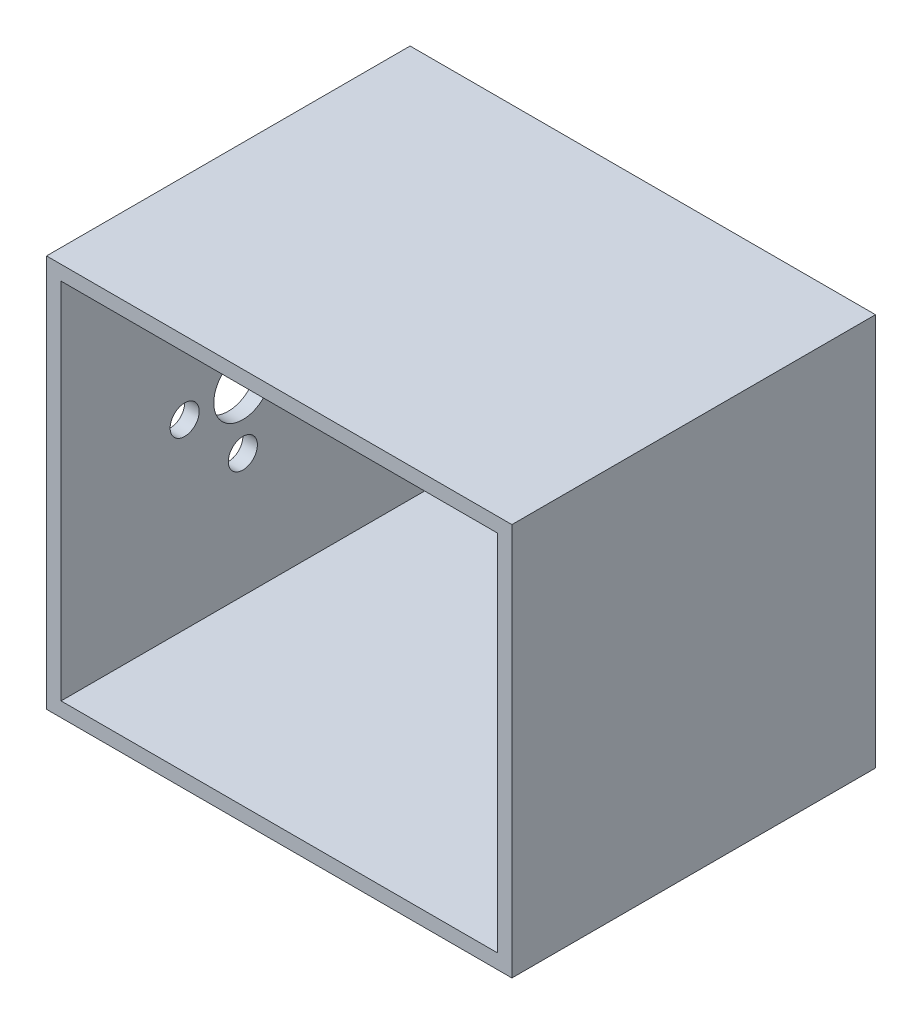
ISO-10303-21;
HEADER;
FILE_DESCRIPTION(('STEP AP214'),'2;1');
FILE_NAME('part.step','',(''),(''),'','','');
FILE_SCHEMA(('AUTOMOTIVE_DESIGN { 1 0 10303 214 1 1 1 1 }'));
ENDSEC;
DATA;
#1=APPLICATION_CONTEXT('core data for automotive mechanical design processes');
#2=APPLICATION_PROTOCOL_DEFINITION('international standard','automotive_design',2000,#1);
#3=PRODUCT_CONTEXT('',#1,'mechanical');
#4=PRODUCT('Part','Part','',(#3));
#5=PRODUCT_RELATED_PRODUCT_CATEGORY('part','',(#4));
#6=PRODUCT_DEFINITION_FORMATION('','',#4);
#7=PRODUCT_DEFINITION_CONTEXT('part definition',#1,'design');
#8=PRODUCT_DEFINITION('design','',#6,#7);
#9=PRODUCT_DEFINITION_SHAPE('','',#8);
#10=(LENGTH_UNIT() NAMED_UNIT(*) SI_UNIT(.MILLI.,.METRE.));
#11=(NAMED_UNIT(*) PLANE_ANGLE_UNIT() SI_UNIT($,.RADIAN.));
#12=(NAMED_UNIT(*) SI_UNIT($,.STERADIAN.) SOLID_ANGLE_UNIT());
#13=UNCERTAINTY_MEASURE_WITH_UNIT(LENGTH_MEASURE(1.E-05),#10,'distance_accuracy_value','');
#14=(GEOMETRIC_REPRESENTATION_CONTEXT(3) GLOBAL_UNCERTAINTY_ASSIGNED_CONTEXT((#13)) GLOBAL_UNIT_ASSIGNED_CONTEXT((#10,
#11,#12)) REPRESENTATION_CONTEXT('',''));
#15=CARTESIAN_POINT('',(0.,0.,0.));
#16=DIRECTION('',(0.,0.,1.));
#17=DIRECTION('',(1.,0.,0.));
#18=AXIS2_PLACEMENT_3D('',#15,#16,#17);
#19=CARTESIAN_POINT('',(0.,0.,50.));
#20=DIRECTION('',(0.,0.,1.));
#21=DIRECTION('',(1.,0.,0.));
#22=AXIS2_PLACEMENT_3D('',#19,#20,#21);
#23=PLANE('',#22);
#24=DIRECTION('',(0.,-1.,0.));
#25=VECTOR('',#24,1.);
#26=CARTESIAN_POINT('',(-2.,0.,50.));
#27=LINE('',#26,#25);
#28=CARTESIAN_POINT('',(-2.,52.,50.));
#29=VERTEX_POINT('',#28);
#30=CARTESIAN_POINT('',(-2.,-2.,50.));
#31=VERTEX_POINT('',#30);
#32=EDGE_CURVE('E162',#29,#31,#27,.T.);
#33=ORIENTED_EDGE('',*,*,#32,.T.);
#34=DIRECTION('',(1.,0.,0.));
#35=VECTOR('',#34,1.);
#36=CARTESIAN_POINT('',(0.,-2.,50.));
#37=LINE('',#36,#35);
#38=CARTESIAN_POINT('',(62.,-2.,50.));
#39=VERTEX_POINT('',#38);
#40=EDGE_CURVE('E165',#31,#39,#37,.T.);
#41=ORIENTED_EDGE('',*,*,#40,.T.);
#42=DIRECTION('',(0.,1.,0.));
#43=VECTOR('',#42,1.);
#44=CARTESIAN_POINT('',(62.,0.,50.));
#45=LINE('',#44,#43);
#46=CARTESIAN_POINT('',(62.,52.,50.));
#47=VERTEX_POINT('',#46);
#48=EDGE_CURVE('E168',#39,#47,#45,.T.);
#49=ORIENTED_EDGE('',*,*,#48,.T.);
#50=DIRECTION('',(-1.,0.,0.));
#51=VECTOR('',#50,1.);
#52=CARTESIAN_POINT('',(0.,52.,50.));
#53=LINE('',#52,#51);
#54=EDGE_CURVE('E170',#47,#29,#53,.T.);
#55=ORIENTED_EDGE('',*,*,#54,.T.);
#56=EDGE_LOOP('',(#33,#41,#49,#55));
#57=FACE_BOUND('',#56,.T.);
#58=DIRECTION('',(1.,0.,0.));
#59=VECTOR('',#58,1.);
#60=CARTESIAN_POINT('',(0.,0.,50.));
#61=LINE('',#60,#59);
#62=CARTESIAN_POINT('',(0.,0.,50.));
#63=VERTEX_POINT('',#62);
#64=CARTESIAN_POINT('',(60.,0.,50.));
#65=VERTEX_POINT('',#64);
#66=EDGE_CURVE('E132',#63,#65,#61,.T.);
#67=ORIENTED_EDGE('',*,*,#66,.F.);
#68=DIRECTION('',(0.,-1.,0.));
#69=VECTOR('',#68,1.);
#70=CARTESIAN_POINT('',(0.,0.,50.));
#71=LINE('',#70,#69);
#72=CARTESIAN_POINT('',(0.,50.,50.));
#73=VERTEX_POINT('',#72);
#74=EDGE_CURVE('E124',#73,#63,#71,.T.);
#75=ORIENTED_EDGE('',*,*,#74,.F.);
#76=DIRECTION('',(-1.,0.,0.));
#77=VECTOR('',#76,1.);
#78=CARTESIAN_POINT('',(0.,50.,50.));
#79=LINE('',#78,#77);
#80=CARTESIAN_POINT('',(60.,50.,50.));
#81=VERTEX_POINT('',#80);
#82=EDGE_CURVE('E146',#81,#73,#79,.T.);
#83=ORIENTED_EDGE('',*,*,#82,.F.);
#84=DIRECTION('',(0.,1.,0.));
#85=VECTOR('',#84,1.);
#86=CARTESIAN_POINT('',(60.,0.,50.));
#87=LINE('',#86,#85);
#88=EDGE_CURVE('E144',#65,#81,#87,.T.);
#89=ORIENTED_EDGE('',*,*,#88,.F.);
#90=EDGE_LOOP('',(#67,#75,#83,#89));
#91=FACE_BOUND('',#90,.T.);
#92=ADVANCED_FACE('F59',(#57,#91),#23,.T.);
#93=CARTESIAN_POINT('',(0.,0.,0.));
#94=DIRECTION('',(0.,0.,1.));
#95=DIRECTION('',(1.,0.,0.));
#96=AXIS2_PLACEMENT_3D('',#93,#94,#95);
#97=PLANE('',#96);
#98=DIRECTION('',(0.,-1.,0.));
#99=VECTOR('',#98,1.);
#100=CARTESIAN_POINT('',(-2.,0.,0.));
#101=LINE('',#100,#99);
#102=CARTESIAN_POINT('',(-2.,52.,0.));
#103=VERTEX_POINT('',#102);
#104=CARTESIAN_POINT('',(-2.,-2.,0.));
#105=VERTEX_POINT('',#104);
#106=EDGE_CURVE('E140',#103,#105,#101,.T.);
#107=ORIENTED_EDGE('',*,*,#106,.F.);
#108=DIRECTION('',(-1.,0.,0.));
#109=VECTOR('',#108,1.);
#110=CARTESIAN_POINT('',(0.,52.,0.));
#111=LINE('',#110,#109);
#112=CARTESIAN_POINT('',(62.,52.,0.));
#113=VERTEX_POINT('',#112);
#114=EDGE_CURVE('E166',#113,#103,#111,.T.);
#115=ORIENTED_EDGE('',*,*,#114,.F.);
#116=DIRECTION('',(0.,1.,0.));
#117=VECTOR('',#116,1.);
#118=CARTESIAN_POINT('',(62.,0.,0.));
#119=LINE('',#118,#117);
#120=CARTESIAN_POINT('',(62.,-2.,0.));
#121=VERTEX_POINT('',#120);
#122=EDGE_CURVE('E177',#121,#113,#119,.T.);
#123=ORIENTED_EDGE('',*,*,#122,.F.);
#124=DIRECTION('',(1.,0.,0.));
#125=VECTOR('',#124,1.);
#126=CARTESIAN_POINT('',(0.,-2.,0.));
#127=LINE('',#126,#125);
#128=EDGE_CURVE('E175',#105,#121,#127,.T.);
#129=ORIENTED_EDGE('',*,*,#128,.F.);
#130=EDGE_LOOP('',(#107,#115,#123,#129));
#131=FACE_BOUND('',#130,.T.);
#132=DIRECTION('',(0.,-1.,0.));
#133=VECTOR('',#132,1.);
#134=CARTESIAN_POINT('',(0.,0.,0.));
#135=LINE('',#134,#133);
#136=CARTESIAN_POINT('',(0.,50.,0.));
#137=VERTEX_POINT('',#136);
#138=CARTESIAN_POINT('',(0.,0.,0.));
#139=VERTEX_POINT('',#138);
#140=EDGE_CURVE('E82',#137,#139,#135,.T.);
#141=ORIENTED_EDGE('',*,*,#140,.T.);
#142=DIRECTION('',(1.,0.,0.));
#143=VECTOR('',#142,1.);
#144=CARTESIAN_POINT('',(0.,0.,0.));
#145=LINE('',#144,#143);
#146=CARTESIAN_POINT('',(60.,0.,0.));
#147=VERTEX_POINT('',#146);
#148=EDGE_CURVE('E139',#139,#147,#145,.T.);
#149=ORIENTED_EDGE('',*,*,#148,.T.);
#150=DIRECTION('',(0.,1.,0.));
#151=VECTOR('',#150,1.);
#152=CARTESIAN_POINT('',(60.,0.,0.));
#153=LINE('',#152,#151);
#154=CARTESIAN_POINT('',(60.,50.,0.));
#155=VERTEX_POINT('',#154);
#156=EDGE_CURVE('E154',#147,#155,#153,.T.);
#157=ORIENTED_EDGE('',*,*,#156,.T.);
#158=DIRECTION('',(-1.,0.,0.));
#159=VECTOR('',#158,1.);
#160=CARTESIAN_POINT('',(0.,50.,0.));
#161=LINE('',#160,#159);
#162=EDGE_CURVE('E133',#155,#137,#161,.T.);
#163=ORIENTED_EDGE('',*,*,#162,.T.);
#164=EDGE_LOOP('',(#141,#149,#157,#163));
#165=FACE_BOUND('',#164,.T.);
#166=ADVANCED_FACE('F195',(#131,#165),#97,.F.);
#167=CARTESIAN_POINT('',(-2.,0.,50.));
#168=DIRECTION('',(1.,0.,0.));
#169=DIRECTION('',(0.,0.,-1.));
#170=AXIS2_PLACEMENT_3D('',#167,#168,#169);
#171=PLANE('',#170);
#172=CARTESIAN_POINT('',(-2.,17.,25.));
#173=DIRECTION('',(-1.,0.,0.));
#174=DIRECTION('',(0.,0.,-1.));
#175=AXIS2_PLACEMENT_3D('',#172,#173,#174);
#176=CIRCLE('',#175,2.);
#177=CARTESIAN_POINT('',(-2.,17.,23.));
#178=VERTEX_POINT('',#177);
#179=EDGE_CURVE('E263',#178,#178,#176,.T.);
#180=ORIENTED_EDGE('',*,*,#179,.F.);
#181=EDGE_LOOP('',(#180));
#182=FACE_BOUND('',#181,.T.);
#183=CARTESIAN_POINT('',(-2.,33.,25.));
#184=DIRECTION('',(-1.,0.,0.));
#185=DIRECTION('',(0.,0.,1.));
#186=AXIS2_PLACEMENT_3D('',#183,#184,#185);
#187=CIRCLE('',#186,2.);
#188=CARTESIAN_POINT('',(-2.,33.,27.));
#189=VERTEX_POINT('',#188);
#190=EDGE_CURVE('E260',#189,#189,#187,.T.);
#191=ORIENTED_EDGE('',*,*,#190,.F.);
#192=EDGE_LOOP('',(#191));
#193=FACE_BOUND('',#192,.T.);
#194=CARTESIAN_POINT('',(-2.,25.,17.));
#195=DIRECTION('',(-1.,0.,0.));
#196=DIRECTION('',(0.,0.,-1.));
#197=AXIS2_PLACEMENT_3D('',#194,#195,#196);
#198=CIRCLE('',#197,2.);
#199=CARTESIAN_POINT('',(-2.,25.,15.));
#200=VERTEX_POINT('',#199);
#201=EDGE_CURVE('E257',#200,#200,#198,.T.);
#202=ORIENTED_EDGE('',*,*,#201,.F.);
#203=EDGE_LOOP('',(#202));
#204=FACE_BOUND('',#203,.T.);
#205=CARTESIAN_POINT('',(-2.,25.,33.));
#206=DIRECTION('',(-1.,0.,0.));
#207=DIRECTION('',(0.,0.,1.));
#208=AXIS2_PLACEMENT_3D('',#205,#206,#207);
#209=CIRCLE('',#208,2.);
#210=CARTESIAN_POINT('',(-2.,25.,35.));
#211=VERTEX_POINT('',#210);
#212=EDGE_CURVE('E251',#211,#211,#209,.T.);
#213=ORIENTED_EDGE('',*,*,#212,.F.);
#214=EDGE_LOOP('',(#213));
#215=FACE_BOUND('',#214,.T.);
#216=CARTESIAN_POINT('',(-2.,25.,25.));
#217=DIRECTION('',(-1.,0.,0.));
#218=DIRECTION('',(0.,0.,1.));
#219=AXIS2_PLACEMENT_3D('',#216,#217,#218);
#220=CIRCLE('',#219,4.);
#221=CARTESIAN_POINT('',(-2.,25.,29.));
#222=VERTEX_POINT('',#221);
#223=EDGE_CURVE('E152',#222,#222,#220,.T.);
#224=ORIENTED_EDGE('',*,*,#223,.F.);
#225=EDGE_LOOP('',(#224));
#226=FACE_BOUND('',#225,.T.);
#227=ORIENTED_EDGE('',*,*,#106,.T.);
#228=DIRECTION('',(0.,0.,-1.));
#229=VECTOR('',#228,1.);
#230=CARTESIAN_POINT('',(-2.,-2.,50.));
#231=LINE('',#230,#229);
#232=EDGE_CURVE('E12',#31,#105,#231,.T.);
#233=ORIENTED_EDGE('',*,*,#232,.F.);
#234=ORIENTED_EDGE('',*,*,#32,.F.);
#235=DIRECTION('',(0.,0.,-1.));
#236=VECTOR('',#235,1.);
#237=CARTESIAN_POINT('',(-2.,52.,50.));
#238=LINE('',#237,#236);
#239=EDGE_CURVE('E172',#29,#103,#238,.T.);
#240=ORIENTED_EDGE('',*,*,#239,.T.);
#241=EDGE_LOOP('',(#227,#233,#234,#240));
#242=FACE_BOUND('',#241,.T.);
#243=ADVANCED_FACE('F61',(#182,#193,#204,#215,#226,#242),#171,.F.);
#244=CARTESIAN_POINT('',(0.,-2.,50.));
#245=DIRECTION('',(0.,1.,0.));
#246=DIRECTION('',(0.,0.,1.));
#247=AXIS2_PLACEMENT_3D('',#244,#245,#246);
#248=PLANE('',#247);
#249=ORIENTED_EDGE('',*,*,#128,.T.);
#250=DIRECTION('',(0.,0.,-1.));
#251=VECTOR('',#250,1.);
#252=CARTESIAN_POINT('',(62.,-2.,50.));
#253=LINE('',#252,#251);
#254=EDGE_CURVE('E67',#39,#121,#253,.T.);
#255=ORIENTED_EDGE('',*,*,#254,.F.);
#256=ORIENTED_EDGE('',*,*,#40,.F.);
#257=ORIENTED_EDGE('',*,*,#232,.T.);
#258=EDGE_LOOP('',(#249,#255,#256,#257));
#259=FACE_BOUND('',#258,.T.);
#260=ADVANCED_FACE('F205',(#259),#248,.F.);
#261=CARTESIAN_POINT('',(62.,0.,50.));
#262=DIRECTION('',(-1.,0.,0.));
#263=DIRECTION('',(0.,0.,1.));
#264=AXIS2_PLACEMENT_3D('',#261,#262,#263);
#265=PLANE('',#264);
#266=ORIENTED_EDGE('',*,*,#122,.T.);
#267=DIRECTION('',(0.,0.,-1.));
#268=VECTOR('',#267,1.);
#269=CARTESIAN_POINT('',(62.,52.,50.));
#270=LINE('',#269,#268);
#271=EDGE_CURVE('E182',#47,#113,#270,.T.);
#272=ORIENTED_EDGE('',*,*,#271,.F.);
#273=ORIENTED_EDGE('',*,*,#48,.F.);
#274=ORIENTED_EDGE('',*,*,#254,.T.);
#275=EDGE_LOOP('',(#266,#272,#273,#274));
#276=FACE_BOUND('',#275,.T.);
#277=ADVANCED_FACE('F189',(#276),#265,.F.);
#278=CARTESIAN_POINT('',(0.,52.,50.));
#279=DIRECTION('',(0.,-1.,0.));
#280=DIRECTION('',(0.,0.,-1.));
#281=AXIS2_PLACEMENT_3D('',#278,#279,#280);
#282=PLANE('',#281);
#283=ORIENTED_EDGE('',*,*,#114,.T.);
#284=ORIENTED_EDGE('',*,*,#239,.F.);
#285=ORIENTED_EDGE('',*,*,#54,.F.);
#286=ORIENTED_EDGE('',*,*,#271,.T.);
#287=EDGE_LOOP('',(#283,#284,#285,#286));
#288=FACE_BOUND('',#287,.T.);
#289=ADVANCED_FACE('F199',(#288),#282,.F.);
#290=CARTESIAN_POINT('',(0.,0.,50.));
#291=DIRECTION('',(1.,0.,0.));
#292=DIRECTION('',(0.,0.,-1.));
#293=AXIS2_PLACEMENT_3D('',#290,#291,#292);
#294=PLANE('',#293);
#295=CARTESIAN_POINT('',(0.,17.,25.));
#296=DIRECTION('',(1.,0.,0.));
#297=DIRECTION('',(0.,0.,-1.));
#298=AXIS2_PLACEMENT_3D('',#295,#296,#297);
#299=CIRCLE('',#298,2.);
#300=CARTESIAN_POINT('',(0.,17.,23.));
#301=VERTEX_POINT('',#300);
#302=EDGE_CURVE('E234',#301,#301,#299,.F.);
#303=ORIENTED_EDGE('',*,*,#302,.T.);
#304=EDGE_LOOP('',(#303));
#305=FACE_BOUND('',#304,.T.);
#306=CARTESIAN_POINT('',(0.,33.,25.));
#307=DIRECTION('',(1.,0.,0.));
#308=DIRECTION('',(0.,0.,-1.));
#309=AXIS2_PLACEMENT_3D('',#306,#307,#308);
#310=CIRCLE('',#309,2.);
#311=CARTESIAN_POINT('',(0.,33.,23.));
#312=VERTEX_POINT('',#311);
#313=EDGE_CURVE('E238',#312,#312,#310,.F.);
#314=ORIENTED_EDGE('',*,*,#313,.T.);
#315=EDGE_LOOP('',(#314));
#316=FACE_BOUND('',#315,.T.);
#317=CARTESIAN_POINT('',(0.,25.,17.));
#318=DIRECTION('',(1.,0.,0.));
#319=DIRECTION('',(0.,0.,-1.));
#320=AXIS2_PLACEMENT_3D('',#317,#318,#319);
#321=CIRCLE('',#320,2.);
#322=CARTESIAN_POINT('',(0.,25.,15.));
#323=VERTEX_POINT('',#322);
#324=EDGE_CURVE('E242',#323,#323,#321,.F.);
#325=ORIENTED_EDGE('',*,*,#324,.T.);
#326=EDGE_LOOP('',(#325));
#327=FACE_BOUND('',#326,.T.);
#328=CARTESIAN_POINT('',(0.,25.,33.));
#329=DIRECTION('',(1.,0.,0.));
#330=DIRECTION('',(0.,0.,-1.));
#331=AXIS2_PLACEMENT_3D('',#328,#329,#330);
#332=CIRCLE('',#331,2.);
#333=CARTESIAN_POINT('',(0.,25.,31.));
#334=VERTEX_POINT('',#333);
#335=EDGE_CURVE('E246',#334,#334,#332,.F.);
#336=ORIENTED_EDGE('',*,*,#335,.T.);
#337=EDGE_LOOP('',(#336));
#338=FACE_BOUND('',#337,.T.);
#339=CARTESIAN_POINT('',(0.,25.,25.));
#340=DIRECTION('',(1.,0.,0.));
#341=DIRECTION('',(0.,0.,-1.));
#342=AXIS2_PLACEMENT_3D('',#339,#340,#341);
#343=CIRCLE('',#342,4.);
#344=CARTESIAN_POINT('',(0.,25.,21.));
#345=VERTEX_POINT('',#344);
#346=EDGE_CURVE('E249',#345,#345,#343,.F.);
#347=ORIENTED_EDGE('',*,*,#346,.T.);
#348=EDGE_LOOP('',(#347));
#349=FACE_BOUND('',#348,.T.);
#350=ORIENTED_EDGE('',*,*,#140,.F.);
#351=DIRECTION('',(0.,0.,-1.));
#352=VECTOR('',#351,1.);
#353=CARTESIAN_POINT('',(0.,50.,50.));
#354=LINE('',#353,#352);
#355=EDGE_CURVE('E128',#73,#137,#354,.T.);
#356=ORIENTED_EDGE('',*,*,#355,.F.);
#357=ORIENTED_EDGE('',*,*,#74,.T.);
#358=DIRECTION('',(0.,0.,-1.));
#359=VECTOR('',#358,1.);
#360=CARTESIAN_POINT('',(0.,0.,50.));
#361=LINE('',#360,#359);
#362=EDGE_CURVE('E127',#63,#139,#361,.T.);
#363=ORIENTED_EDGE('',*,*,#362,.T.);
#364=EDGE_LOOP('',(#350,#356,#357,#363));
#365=FACE_BOUND('',#364,.T.);
#366=ADVANCED_FACE('F126',(#305,#316,#327,#338,#349,#365),#294,.T.);
#367=CARTESIAN_POINT('',(0.,0.,50.));
#368=DIRECTION('',(0.,1.,0.));
#369=DIRECTION('',(0.,0.,1.));
#370=AXIS2_PLACEMENT_3D('',#367,#368,#369);
#371=PLANE('',#370);
#372=ORIENTED_EDGE('',*,*,#148,.F.);
#373=ORIENTED_EDGE('',*,*,#362,.F.);
#374=ORIENTED_EDGE('',*,*,#66,.T.);
#375=DIRECTION('',(0.,0.,-1.));
#376=VECTOR('',#375,1.);
#377=CARTESIAN_POINT('',(60.,0.,50.));
#378=LINE('',#377,#376);
#379=EDGE_CURVE('E141',#65,#147,#378,.T.);
#380=ORIENTED_EDGE('',*,*,#379,.T.);
#381=EDGE_LOOP('',(#372,#373,#374,#380));
#382=FACE_BOUND('',#381,.T.);
#383=ADVANCED_FACE('F136',(#382),#371,.T.);
#384=CARTESIAN_POINT('',(60.,0.,50.));
#385=DIRECTION('',(-1.,0.,0.));
#386=DIRECTION('',(0.,0.,1.));
#387=AXIS2_PLACEMENT_3D('',#384,#385,#386);
#388=PLANE('',#387);
#389=ORIENTED_EDGE('',*,*,#156,.F.);
#390=ORIENTED_EDGE('',*,*,#379,.F.);
#391=ORIENTED_EDGE('',*,*,#88,.T.);
#392=DIRECTION('',(0.,0.,-1.));
#393=VECTOR('',#392,1.);
#394=CARTESIAN_POINT('',(60.,50.,50.));
#395=LINE('',#394,#393);
#396=EDGE_CURVE('E74',#81,#155,#395,.T.);
#397=ORIENTED_EDGE('',*,*,#396,.T.);
#398=EDGE_LOOP('',(#389,#390,#391,#397));
#399=FACE_BOUND('',#398,.T.);
#400=ADVANCED_FACE('F230',(#399),#388,.T.);
#401=CARTESIAN_POINT('',(0.,50.,50.));
#402=DIRECTION('',(0.,-1.,0.));
#403=DIRECTION('',(0.,0.,-1.));
#404=AXIS2_PLACEMENT_3D('',#401,#402,#403);
#405=PLANE('',#404);
#406=ORIENTED_EDGE('',*,*,#162,.F.);
#407=ORIENTED_EDGE('',*,*,#396,.F.);
#408=ORIENTED_EDGE('',*,*,#82,.T.);
#409=ORIENTED_EDGE('',*,*,#355,.T.);
#410=EDGE_LOOP('',(#406,#407,#408,#409));
#411=FACE_BOUND('',#410,.T.);
#412=ADVANCED_FACE('F283',(#411),#405,.T.);
#413=CARTESIAN_POINT('',(62.001,25.,25.));
#414=DIRECTION('',(-1.,0.,0.));
#415=DIRECTION('',(0.,0.,1.));
#416=AXIS2_PLACEMENT_3D('',#413,#414,#415);
#417=CYLINDRICAL_SURFACE('',#416,4.);
#418=ORIENTED_EDGE('',*,*,#346,.F.);
#419=EDGE_LOOP('',(#418));
#420=FACE_BOUND('',#419,.T.);
#421=ORIENTED_EDGE('',*,*,#223,.T.);
#422=EDGE_LOOP('',(#421));
#423=FACE_BOUND('',#422,.T.);
#424=ADVANCED_FACE('F280',(#420,#423),#417,.F.);
#425=CARTESIAN_POINT('',(62.001,25.,33.));
#426=DIRECTION('',(-1.,0.,0.));
#427=DIRECTION('',(0.,0.,1.));
#428=AXIS2_PLACEMENT_3D('',#425,#426,#427);
#429=CYLINDRICAL_SURFACE('',#428,2.);
#430=ORIENTED_EDGE('',*,*,#335,.F.);
#431=EDGE_LOOP('',(#430));
#432=FACE_BOUND('',#431,.T.);
#433=ORIENTED_EDGE('',*,*,#212,.T.);
#434=EDGE_LOOP('',(#433));
#435=FACE_BOUND('',#434,.T.);
#436=ADVANCED_FACE('F282',(#432,#435),#429,.F.);
#437=CARTESIAN_POINT('',(62.001,25.,17.));
#438=DIRECTION('',(-1.,0.,0.));
#439=DIRECTION('',(0.,0.,1.));
#440=AXIS2_PLACEMENT_3D('',#437,#438,#439);
#441=CYLINDRICAL_SURFACE('',#440,2.);
#442=ORIENTED_EDGE('',*,*,#324,.F.);
#443=EDGE_LOOP('',(#442));
#444=FACE_BOUND('',#443,.T.);
#445=ORIENTED_EDGE('',*,*,#201,.T.);
#446=EDGE_LOOP('',(#445));
#447=FACE_BOUND('',#446,.T.);
#448=ADVANCED_FACE('F289',(#444,#447),#441,.F.);
#449=CARTESIAN_POINT('',(62.001,33.,25.));
#450=DIRECTION('',(-1.,0.,0.));
#451=DIRECTION('',(0.,0.,1.));
#452=AXIS2_PLACEMENT_3D('',#449,#450,#451);
#453=CYLINDRICAL_SURFACE('',#452,2.);
#454=ORIENTED_EDGE('',*,*,#313,.F.);
#455=EDGE_LOOP('',(#454));
#456=FACE_BOUND('',#455,.T.);
#457=ORIENTED_EDGE('',*,*,#190,.T.);
#458=EDGE_LOOP('',(#457));
#459=FACE_BOUND('',#458,.T.);
#460=ADVANCED_FACE('F271',(#456,#459),#453,.F.);
#461=CARTESIAN_POINT('',(62.001,17.,25.));
#462=DIRECTION('',(-1.,0.,0.));
#463=DIRECTION('',(0.,0.,1.));
#464=AXIS2_PLACEMENT_3D('',#461,#462,#463);
#465=CYLINDRICAL_SURFACE('',#464,2.);
#466=ORIENTED_EDGE('',*,*,#302,.F.);
#467=EDGE_LOOP('',(#466));
#468=FACE_BOUND('',#467,.T.);
#469=ORIENTED_EDGE('',*,*,#179,.T.);
#470=EDGE_LOOP('',(#469));
#471=FACE_BOUND('',#470,.T.);
#472=ADVANCED_FACE('F347',(#468,#471),#465,.F.);
#473=CLOSED_SHELL('',(#92,#166,#243,#260,#277,#289,#366,#383,#400,#412,#424,#436,#448,#460,#472));
#474=MANIFOLD_SOLID_BREP('B2',#473);
#475=ADVANCED_BREP_SHAPE_REPRESENTATION('',(#18,#474),#14);
#476=SHAPE_DEFINITION_REPRESENTATION(#9,#475);
ENDSEC;
END-ISO-10303-21;
